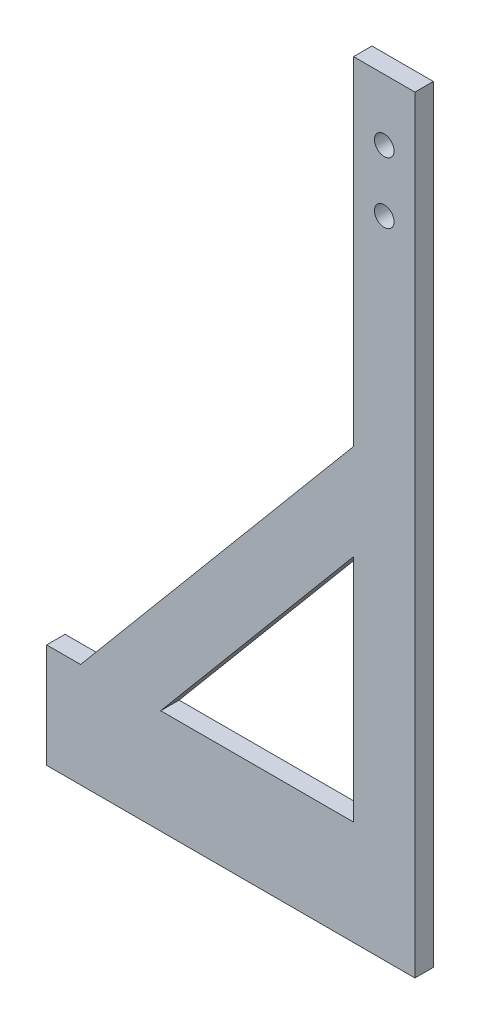
ISO-10303-21;
HEADER;
FILE_DESCRIPTION(('STEP AP214'),'2;1');
FILE_NAME('part.step','',(''),(''),'','','');
FILE_SCHEMA(('AUTOMOTIVE_DESIGN { 1 0 10303 214 1 1 1 1 }'));
ENDSEC;
DATA;
#1=APPLICATION_CONTEXT('core data for automotive mechanical design processes');
#2=APPLICATION_PROTOCOL_DEFINITION('international standard','automotive_design',2000,#1);
#3=PRODUCT_CONTEXT('',#1,'mechanical');
#4=PRODUCT('Part','Part','',(#3));
#5=PRODUCT_RELATED_PRODUCT_CATEGORY('part','',(#4));
#6=PRODUCT_DEFINITION_FORMATION('','',#4);
#7=PRODUCT_DEFINITION_CONTEXT('part definition',#1,'design');
#8=PRODUCT_DEFINITION('design','',#6,#7);
#9=PRODUCT_DEFINITION_SHAPE('','',#8);
#10=(LENGTH_UNIT() NAMED_UNIT(*) SI_UNIT(.MILLI.,.METRE.));
#11=(NAMED_UNIT(*) PLANE_ANGLE_UNIT() SI_UNIT($,.RADIAN.));
#12=(NAMED_UNIT(*) SI_UNIT($,.STERADIAN.) SOLID_ANGLE_UNIT());
#13=UNCERTAINTY_MEASURE_WITH_UNIT(LENGTH_MEASURE(1.E-05),#10,'distance_accuracy_value','');
#14=(GEOMETRIC_REPRESENTATION_CONTEXT(3) GLOBAL_UNCERTAINTY_ASSIGNED_CONTEXT((#13)) GLOBAL_UNIT_ASSIGNED_CONTEXT((#10,
#11,#12)) REPRESENTATION_CONTEXT('',''));
#15=CARTESIAN_POINT('',(0.,0.,0.));
#16=DIRECTION('',(0.,0.,1.));
#17=DIRECTION('',(1.,0.,0.));
#18=AXIS2_PLACEMENT_3D('',#15,#16,#17);
#19=CARTESIAN_POINT('',(0.,0.,3.));
#20=DIRECTION('',(0.,0.,1.));
#21=DIRECTION('',(1.,0.,0.));
#22=AXIS2_PLACEMENT_3D('',#19,#20,#21);
#23=PLANE('',#22);
#24=CARTESIAN_POINT('',(-5.,115.,3.));
#25=DIRECTION('',(0.,0.,1.));
#26=DIRECTION('',(1.,0.,0.));
#27=AXIS2_PLACEMENT_3D('',#24,#25,#26);
#28=CIRCLE('',#27,1.59999999999999);
#29=CARTESIAN_POINT('',(-3.40000000000001,115.,3.));
#30=VERTEX_POINT('',#29);
#31=EDGE_CURVE('E258',#30,#30,#28,.T.);
#32=ORIENTED_EDGE('',*,*,#31,.F.);
#33=EDGE_LOOP('',(#32));
#34=FACE_BOUND('',#33,.T.);
#35=CARTESIAN_POINT('',(-5.,105.,3.));
#36=DIRECTION('',(0.,0.,1.));
#37=DIRECTION('',(1.,0.,0.));
#38=AXIS2_PLACEMENT_3D('',#35,#36,#37);
#39=CIRCLE('',#38,1.59999999999999);
#40=CARTESIAN_POINT('',(-3.40000000000001,105.,3.));
#41=VERTEX_POINT('',#40);
#42=EDGE_CURVE('E261',#41,#41,#39,.T.);
#43=ORIENTED_EDGE('',*,*,#42,.F.);
#44=EDGE_LOOP('',(#43));
#45=FACE_BOUND('',#44,.T.);
#46=DIRECTION('',(-1.,0.,0.));
#47=VECTOR('',#46,1.);
#48=CARTESIAN_POINT('',(-54.4722804523963,17.,3.));
#49=LINE('',#48,#47);
#50=CARTESIAN_POINT('',(-54.4722804523963,17.,3.));
#51=VERTEX_POINT('',#50);
#52=CARTESIAN_POINT('',(-60.,17.,3.));
#53=VERTEX_POINT('',#52);
#54=EDGE_CURVE('E140',#51,#53,#49,.T.);
#55=ORIENTED_EDGE('',*,*,#54,.T.);
#56=DIRECTION('',(0.,-1.,0.));
#57=VECTOR('',#56,1.);
#58=CARTESIAN_POINT('',(-60.,17.,3.));
#59=LINE('',#58,#57);
#60=CARTESIAN_POINT('',(-60.,0.,3.));
#61=VERTEX_POINT('',#60);
#62=EDGE_CURVE('E143',#53,#61,#59,.T.);
#63=ORIENTED_EDGE('',*,*,#62,.T.);
#64=DIRECTION('',(1.,0.,0.));
#65=VECTOR('',#64,1.);
#66=CARTESIAN_POINT('',(-60.,0.,3.));
#67=LINE('',#66,#65);
#68=CARTESIAN_POINT('',(0.,0.,3.));
#69=VERTEX_POINT('',#68);
#70=EDGE_CURVE('E146',#61,#69,#67,.T.);
#71=ORIENTED_EDGE('',*,*,#70,.T.);
#72=DIRECTION('',(0.,1.,0.));
#73=VECTOR('',#72,1.);
#74=CARTESIAN_POINT('',(0.,0.,3.));
#75=LINE('',#74,#73);
#76=CARTESIAN_POINT('',(0.,125.,3.));
#77=VERTEX_POINT('',#76);
#78=EDGE_CURVE('E148',#69,#77,#75,.T.);
#79=ORIENTED_EDGE('',*,*,#78,.T.);
#80=DIRECTION('',(-1.,0.,0.));
#81=VECTOR('',#80,1.);
#82=CARTESIAN_POINT('',(-10.,125.,3.));
#83=LINE('',#82,#81);
#84=CARTESIAN_POINT('',(-10.,125.,3.));
#85=VERTEX_POINT('',#84);
#86=EDGE_CURVE('E150',#77,#85,#83,.T.);
#87=ORIENTED_EDGE('',*,*,#86,.T.);
#88=DIRECTION('',(0.,-1.,0.));
#89=VECTOR('',#88,1.);
#90=CARTESIAN_POINT('',(-10.,70.,3.));
#91=LINE('',#90,#89);
#92=CARTESIAN_POINT('',(-10.,70.,3.));
#93=VERTEX_POINT('',#92);
#94=EDGE_CURVE('E152',#85,#93,#91,.T.);
#95=ORIENTED_EDGE('',*,*,#94,.T.);
#96=DIRECTION('',(-0.642787609686543,-0.766044443118975,0.));
#97=VECTOR('',#96,1.);
#98=CARTESIAN_POINT('',(-10.,70.,3.));
#99=LINE('',#98,#97);
#100=EDGE_CURVE('E154',#93,#51,#99,.T.);
#101=ORIENTED_EDGE('',*,*,#100,.T.);
#102=EDGE_LOOP('',(#55,#63,#71,#79,#87,#95,#101));
#103=FACE_BOUND('',#102,.T.);
#104=DIRECTION('',(-0.642787609686544,-0.766044443118975,0.));
#105=VECTOR('',#104,1.);
#106=CARTESIAN_POINT('',(-10.,54.442761731396,3.));
#107=LINE('',#106,#105);
#108=CARTESIAN_POINT('',(-10.,54.442761731396,3.));
#109=VERTEX_POINT('',#108);
#110=CARTESIAN_POINT('',(-41.4182075590735,17.,3.));
#111=VERTEX_POINT('',#110);
#112=EDGE_CURVE('E119',#109,#111,#107,.T.);
#113=ORIENTED_EDGE('',*,*,#112,.F.);
#114=DIRECTION('',(0.,1.,0.));
#115=VECTOR('',#114,1.);
#116=CARTESIAN_POINT('',(-10.,17.,3.));
#117=LINE('',#116,#115);
#118=CARTESIAN_POINT('',(-10.,17.,3.));
#119=VERTEX_POINT('',#118);
#120=EDGE_CURVE('E111',#119,#109,#117,.T.);
#121=ORIENTED_EDGE('',*,*,#120,.F.);
#122=DIRECTION('',(1.,0.,0.));
#123=VECTOR('',#122,1.);
#124=CARTESIAN_POINT('',(-41.4182075590735,17.,3.));
#125=LINE('',#124,#123);
#126=EDGE_CURVE('E128',#111,#119,#125,.T.);
#127=ORIENTED_EDGE('',*,*,#126,.F.);
#128=EDGE_LOOP('',(#113,#121,#127));
#129=FACE_BOUND('',#128,.T.);
#130=ADVANCED_FACE('F33',(#34,#45,#103,#129),#23,.T.);
#131=CARTESIAN_POINT('',(0.,0.,0.));
#132=DIRECTION('',(0.,0.,1.));
#133=DIRECTION('',(1.,0.,0.));
#134=AXIS2_PLACEMENT_3D('',#131,#132,#133);
#135=PLANE('',#134);
#136=CARTESIAN_POINT('',(-5.,115.,0.));
#137=DIRECTION('',(0.,0.,1.));
#138=DIRECTION('',(1.,0.,0.));
#139=AXIS2_PLACEMENT_3D('',#136,#137,#138);
#140=CIRCLE('',#139,1.59999999999999);
#141=CARTESIAN_POINT('',(-3.40000000000001,115.,0.));
#142=VERTEX_POINT('',#141);
#143=EDGE_CURVE('E37',#142,#142,#140,.T.);
#144=ORIENTED_EDGE('',*,*,#143,.T.);
#145=EDGE_LOOP('',(#144));
#146=FACE_BOUND('',#145,.T.);
#147=CARTESIAN_POINT('',(-5.,105.,0.));
#148=DIRECTION('',(0.,0.,1.));
#149=DIRECTION('',(1.,0.,0.));
#150=AXIS2_PLACEMENT_3D('',#147,#148,#149);
#151=CIRCLE('',#150,1.59999999999999);
#152=CARTESIAN_POINT('',(-3.40000000000001,105.,0.));
#153=VERTEX_POINT('',#152);
#154=EDGE_CURVE('E134',#153,#153,#151,.T.);
#155=ORIENTED_EDGE('',*,*,#154,.T.);
#156=EDGE_LOOP('',(#155));
#157=FACE_BOUND('',#156,.T.);
#158=DIRECTION('',(-1.,0.,0.));
#159=VECTOR('',#158,1.);
#160=CARTESIAN_POINT('',(-54.4722804523963,17.,0.));
#161=LINE('',#160,#159);
#162=CARTESIAN_POINT('',(-54.4722804523963,17.,0.));
#163=VERTEX_POINT('',#162);
#164=CARTESIAN_POINT('',(-60.,17.,0.));
#165=VERTEX_POINT('',#164);
#166=EDGE_CURVE('E126',#163,#165,#161,.T.);
#167=ORIENTED_EDGE('',*,*,#166,.F.);
#168=DIRECTION('',(-0.642787609686543,-0.766044443118975,0.));
#169=VECTOR('',#168,1.);
#170=CARTESIAN_POINT('',(-10.,70.,0.));
#171=LINE('',#170,#169);
#172=CARTESIAN_POINT('',(-10.,70.,0.));
#173=VERTEX_POINT('',#172);
#174=EDGE_CURVE('E144',#173,#163,#171,.T.);
#175=ORIENTED_EDGE('',*,*,#174,.F.);
#176=DIRECTION('',(0.,-1.,0.));
#177=VECTOR('',#176,1.);
#178=CARTESIAN_POINT('',(-10.,70.,0.));
#179=LINE('',#178,#177);
#180=CARTESIAN_POINT('',(-10.,125.,0.));
#181=VERTEX_POINT('',#180);
#182=EDGE_CURVE('E167',#181,#173,#179,.T.);
#183=ORIENTED_EDGE('',*,*,#182,.F.);
#184=DIRECTION('',(-1.,0.,0.));
#185=VECTOR('',#184,1.);
#186=CARTESIAN_POINT('',(-10.,125.,0.));
#187=LINE('',#186,#185);
#188=CARTESIAN_POINT('',(0.,125.,0.));
#189=VERTEX_POINT('',#188);
#190=EDGE_CURVE('E165',#189,#181,#187,.T.);
#191=ORIENTED_EDGE('',*,*,#190,.F.);
#192=DIRECTION('',(0.,1.,0.));
#193=VECTOR('',#192,1.);
#194=CARTESIAN_POINT('',(0.,0.,0.));
#195=LINE('',#194,#193);
#196=CARTESIAN_POINT('',(0.,0.,0.));
#197=VERTEX_POINT('',#196);
#198=EDGE_CURVE('E163',#197,#189,#195,.T.);
#199=ORIENTED_EDGE('',*,*,#198,.F.);
#200=DIRECTION('',(1.,0.,0.));
#201=VECTOR('',#200,1.);
#202=CARTESIAN_POINT('',(-60.,0.,0.));
#203=LINE('',#202,#201);
#204=CARTESIAN_POINT('',(-60.,0.,0.));
#205=VERTEX_POINT('',#204);
#206=EDGE_CURVE('E161',#205,#197,#203,.T.);
#207=ORIENTED_EDGE('',*,*,#206,.F.);
#208=DIRECTION('',(0.,-1.,0.));
#209=VECTOR('',#208,1.);
#210=CARTESIAN_POINT('',(-60.,17.,0.));
#211=LINE('',#210,#209);
#212=EDGE_CURVE('E159',#165,#205,#211,.T.);
#213=ORIENTED_EDGE('',*,*,#212,.F.);
#214=EDGE_LOOP('',(#167,#175,#183,#191,#199,#207,#213));
#215=FACE_BOUND('',#214,.T.);
#216=DIRECTION('',(0.,1.,0.));
#217=VECTOR('',#216,1.);
#218=CARTESIAN_POINT('',(-10.,17.,0.));
#219=LINE('',#218,#217);
#220=CARTESIAN_POINT('',(-10.,17.,0.));
#221=VERTEX_POINT('',#220);
#222=CARTESIAN_POINT('',(-10.,54.442761731396,0.));
#223=VERTEX_POINT('',#222);
#224=EDGE_CURVE('E57',#221,#223,#219,.T.);
#225=ORIENTED_EDGE('',*,*,#224,.T.);
#226=DIRECTION('',(-0.642787609686544,-0.766044443118975,0.));
#227=VECTOR('',#226,1.);
#228=CARTESIAN_POINT('',(-10.,54.442761731396,0.));
#229=LINE('',#228,#227);
#230=CARTESIAN_POINT('',(-41.4182075590735,17.,0.));
#231=VERTEX_POINT('',#230);
#232=EDGE_CURVE('E125',#223,#231,#229,.T.);
#233=ORIENTED_EDGE('',*,*,#232,.T.);
#234=DIRECTION('',(1.,0.,0.));
#235=VECTOR('',#234,1.);
#236=CARTESIAN_POINT('',(-41.4182075590735,17.,0.));
#237=LINE('',#236,#235);
#238=EDGE_CURVE('E120',#231,#221,#237,.T.);
#239=ORIENTED_EDGE('',*,*,#238,.T.);
#240=EDGE_LOOP('',(#225,#233,#239));
#241=FACE_BOUND('',#240,.T.);
#242=ADVANCED_FACE('F195',(#146,#157,#215,#241),#135,.F.);
#243=CARTESIAN_POINT('',(-54.4722804523963,17.,3.));
#244=DIRECTION('',(0.,-1.,0.));
#245=DIRECTION('',(0.,0.,-1.));
#246=AXIS2_PLACEMENT_3D('',#243,#244,#245);
#247=PLANE('',#246);
#248=ORIENTED_EDGE('',*,*,#166,.T.);
#249=DIRECTION('',(0.,0.,-1.));
#250=VECTOR('',#249,1.);
#251=CARTESIAN_POINT('',(-60.,17.,3.));
#252=LINE('',#251,#250);
#253=EDGE_CURVE('E11',#53,#165,#252,.T.);
#254=ORIENTED_EDGE('',*,*,#253,.F.);
#255=ORIENTED_EDGE('',*,*,#54,.F.);
#256=DIRECTION('',(0.,0.,-1.));
#257=VECTOR('',#256,1.);
#258=CARTESIAN_POINT('',(-54.4722804523963,17.,3.));
#259=LINE('',#258,#257);
#260=EDGE_CURVE('E156',#51,#163,#259,.T.);
#261=ORIENTED_EDGE('',*,*,#260,.T.);
#262=EDGE_LOOP('',(#248,#254,#255,#261));
#263=FACE_BOUND('',#262,.T.);
#264=ADVANCED_FACE('F35',(#263),#247,.F.);
#265=CARTESIAN_POINT('',(-60.,17.,3.));
#266=DIRECTION('',(1.,0.,0.));
#267=DIRECTION('',(0.,0.,-1.));
#268=AXIS2_PLACEMENT_3D('',#265,#266,#267);
#269=PLANE('',#268);
#270=ORIENTED_EDGE('',*,*,#212,.T.);
#271=DIRECTION('',(0.,0.,-1.));
#272=VECTOR('',#271,1.);
#273=CARTESIAN_POINT('',(-60.,0.,3.));
#274=LINE('',#273,#272);
#275=EDGE_CURVE('E42',#61,#205,#274,.T.);
#276=ORIENTED_EDGE('',*,*,#275,.F.);
#277=ORIENTED_EDGE('',*,*,#62,.F.);
#278=ORIENTED_EDGE('',*,*,#253,.T.);
#279=EDGE_LOOP('',(#270,#276,#277,#278));
#280=FACE_BOUND('',#279,.T.);
#281=ADVANCED_FACE('F212',(#280),#269,.F.);
#282=CARTESIAN_POINT('',(-60.,0.,3.));
#283=DIRECTION('',(0.,1.,0.));
#284=DIRECTION('',(0.,0.,1.));
#285=AXIS2_PLACEMENT_3D('',#282,#283,#284);
#286=PLANE('',#285);
#287=ORIENTED_EDGE('',*,*,#206,.T.);
#288=DIRECTION('',(0.,0.,-1.));
#289=VECTOR('',#288,1.);
#290=CARTESIAN_POINT('',(0.,0.,3.));
#291=LINE('',#290,#289);
#292=EDGE_CURVE('E181',#69,#197,#291,.T.);
#293=ORIENTED_EDGE('',*,*,#292,.F.);
#294=ORIENTED_EDGE('',*,*,#70,.F.);
#295=ORIENTED_EDGE('',*,*,#275,.T.);
#296=EDGE_LOOP('',(#287,#293,#294,#295));
#297=FACE_BOUND('',#296,.T.);
#298=ADVANCED_FACE('F189',(#297),#286,.F.);
#299=CARTESIAN_POINT('',(0.,0.,3.));
#300=DIRECTION('',(-1.,0.,0.));
#301=DIRECTION('',(0.,0.,1.));
#302=AXIS2_PLACEMENT_3D('',#299,#300,#301);
#303=PLANE('',#302);
#304=ORIENTED_EDGE('',*,*,#198,.T.);
#305=DIRECTION('',(0.,0.,-1.));
#306=VECTOR('',#305,1.);
#307=CARTESIAN_POINT('',(0.,125.,3.));
#308=LINE('',#307,#306);
#309=EDGE_CURVE('E178',#77,#189,#308,.T.);
#310=ORIENTED_EDGE('',*,*,#309,.F.);
#311=ORIENTED_EDGE('',*,*,#78,.F.);
#312=ORIENTED_EDGE('',*,*,#292,.T.);
#313=EDGE_LOOP('',(#304,#310,#311,#312));
#314=FACE_BOUND('',#313,.T.);
#315=ADVANCED_FACE('F201',(#314),#303,.F.);
#316=CARTESIAN_POINT('',(-10.,125.,3.));
#317=DIRECTION('',(0.,-1.,0.));
#318=DIRECTION('',(0.,0.,-1.));
#319=AXIS2_PLACEMENT_3D('',#316,#317,#318);
#320=PLANE('',#319);
#321=ORIENTED_EDGE('',*,*,#190,.T.);
#322=DIRECTION('',(0.,0.,-1.));
#323=VECTOR('',#322,1.);
#324=CARTESIAN_POINT('',(-10.,125.,3.));
#325=LINE('',#324,#323);
#326=EDGE_CURVE('E175',#85,#181,#325,.T.);
#327=ORIENTED_EDGE('',*,*,#326,.F.);
#328=ORIENTED_EDGE('',*,*,#86,.F.);
#329=ORIENTED_EDGE('',*,*,#309,.T.);
#330=EDGE_LOOP('',(#321,#327,#328,#329));
#331=FACE_BOUND('',#330,.T.);
#332=ADVANCED_FACE('F205',(#331),#320,.F.);
#333=CARTESIAN_POINT('',(-10.,70.,3.));
#334=DIRECTION('',(1.,0.,0.));
#335=DIRECTION('',(0.,1.,0.));
#336=AXIS2_PLACEMENT_3D('',#333,#334,#335);
#337=PLANE('',#336);
#338=ORIENTED_EDGE('',*,*,#182,.T.);
#339=DIRECTION('',(0.,0.,-1.));
#340=VECTOR('',#339,1.);
#341=CARTESIAN_POINT('',(-10.,70.,3.));
#342=LINE('',#341,#340);
#343=EDGE_CURVE('E172',#93,#173,#342,.T.);
#344=ORIENTED_EDGE('',*,*,#343,.F.);
#345=ORIENTED_EDGE('',*,*,#94,.F.);
#346=ORIENTED_EDGE('',*,*,#326,.T.);
#347=EDGE_LOOP('',(#338,#344,#345,#346));
#348=FACE_BOUND('',#347,.T.);
#349=ADVANCED_FACE('F220',(#348),#337,.F.);
#350=CARTESIAN_POINT('',(-10.,70.,3.));
#351=DIRECTION('',(0.766044443118974,-0.642787609686543,0.));
#352=DIRECTION('',(0.642787609686544,0.766044443118975,0.));
#353=AXIS2_PLACEMENT_3D('',#350,#351,#352);
#354=PLANE('',#353);
#355=ORIENTED_EDGE('',*,*,#174,.T.);
#356=ORIENTED_EDGE('',*,*,#260,.F.);
#357=ORIENTED_EDGE('',*,*,#100,.F.);
#358=ORIENTED_EDGE('',*,*,#343,.T.);
#359=EDGE_LOOP('',(#355,#356,#357,#358));
#360=FACE_BOUND('',#359,.T.);
#361=ADVANCED_FACE('F217',(#360),#354,.F.);
#362=CARTESIAN_POINT('',(-10.,17.,3.));
#363=DIRECTION('',(-1.,0.,0.));
#364=DIRECTION('',(0.,-1.,0.));
#365=AXIS2_PLACEMENT_3D('',#362,#363,#364);
#366=PLANE('',#365);
#367=ORIENTED_EDGE('',*,*,#224,.F.);
#368=DIRECTION('',(0.,0.,-1.));
#369=VECTOR('',#368,1.);
#370=CARTESIAN_POINT('',(-10.,17.,3.));
#371=LINE('',#370,#369);
#372=EDGE_CURVE('E115',#119,#221,#371,.T.);
#373=ORIENTED_EDGE('',*,*,#372,.F.);
#374=ORIENTED_EDGE('',*,*,#120,.T.);
#375=DIRECTION('',(0.,0.,-1.));
#376=VECTOR('',#375,1.);
#377=CARTESIAN_POINT('',(-10.,54.442761731396,3.));
#378=LINE('',#377,#376);
#379=EDGE_CURVE('E114',#109,#223,#378,.T.);
#380=ORIENTED_EDGE('',*,*,#379,.T.);
#381=EDGE_LOOP('',(#367,#373,#374,#380));
#382=FACE_BOUND('',#381,.T.);
#383=ADVANCED_FACE('F113',(#382),#366,.T.);
#384=CARTESIAN_POINT('',(-10.,54.442761731396,3.));
#385=DIRECTION('',(0.766044443118974,-0.642787609686544,0.));
#386=DIRECTION('',(0.642787609686544,0.766044443118974,0.));
#387=AXIS2_PLACEMENT_3D('',#384,#385,#386);
#388=PLANE('',#387);
#389=ORIENTED_EDGE('',*,*,#232,.F.);
#390=ORIENTED_EDGE('',*,*,#379,.F.);
#391=ORIENTED_EDGE('',*,*,#112,.T.);
#392=DIRECTION('',(0.,0.,-1.));
#393=VECTOR('',#392,1.);
#394=CARTESIAN_POINT('',(-41.4182075590735,17.,3.));
#395=LINE('',#394,#393);
#396=EDGE_CURVE('E49',#111,#231,#395,.T.);
#397=ORIENTED_EDGE('',*,*,#396,.T.);
#398=EDGE_LOOP('',(#389,#390,#391,#397));
#399=FACE_BOUND('',#398,.T.);
#400=ADVANCED_FACE('F123',(#399),#388,.T.);
#401=CARTESIAN_POINT('',(-41.4182075590735,17.,3.));
#402=DIRECTION('',(0.,1.,0.));
#403=DIRECTION('',(0.,0.,1.));
#404=AXIS2_PLACEMENT_3D('',#401,#402,#403);
#405=PLANE('',#404);
#406=ORIENTED_EDGE('',*,*,#238,.F.);
#407=ORIENTED_EDGE('',*,*,#396,.F.);
#408=ORIENTED_EDGE('',*,*,#126,.T.);
#409=ORIENTED_EDGE('',*,*,#372,.T.);
#410=EDGE_LOOP('',(#406,#407,#408,#409));
#411=FACE_BOUND('',#410,.T.);
#412=ADVANCED_FACE('F244',(#411),#405,.T.);
#413=CARTESIAN_POINT('',(-5.,105.,3.));
#414=DIRECTION('',(0.,0.,1.));
#415=DIRECTION('',(1.,0.,0.));
#416=AXIS2_PLACEMENT_3D('',#413,#414,#415);
#417=CYLINDRICAL_SURFACE('',#416,1.59999999999999);
#418=ORIENTED_EDGE('',*,*,#42,.T.);
#419=EDGE_LOOP('',(#418));
#420=FACE_BOUND('',#419,.T.);
#421=ORIENTED_EDGE('',*,*,#154,.F.);
#422=EDGE_LOOP('',(#421));
#423=FACE_BOUND('',#422,.T.);
#424=ADVANCED_FACE('F247',(#420,#423),#417,.F.);
#425=CARTESIAN_POINT('',(-5.,115.,3.));
#426=DIRECTION('',(0.,0.,1.));
#427=DIRECTION('',(1.,0.,0.));
#428=AXIS2_PLACEMENT_3D('',#425,#426,#427);
#429=CYLINDRICAL_SURFACE('',#428,1.59999999999999);
#430=ORIENTED_EDGE('',*,*,#31,.T.);
#431=EDGE_LOOP('',(#430));
#432=FACE_BOUND('',#431,.T.);
#433=ORIENTED_EDGE('',*,*,#143,.F.);
#434=EDGE_LOOP('',(#433));
#435=FACE_BOUND('',#434,.T.);
#436=ADVANCED_FACE('F250',(#432,#435),#429,.F.);
#437=CLOSED_SHELL('',(#130,#242,#264,#281,#298,#315,#332,#349,#361,#383,#400,#412,#424,#436));
#438=MANIFOLD_SOLID_BREP('B2',#437);
#439=ADVANCED_BREP_SHAPE_REPRESENTATION('',(#18,#438),#14);
#440=SHAPE_DEFINITION_REPRESENTATION(#9,#439);
ENDSEC;
END-ISO-10303-21;
